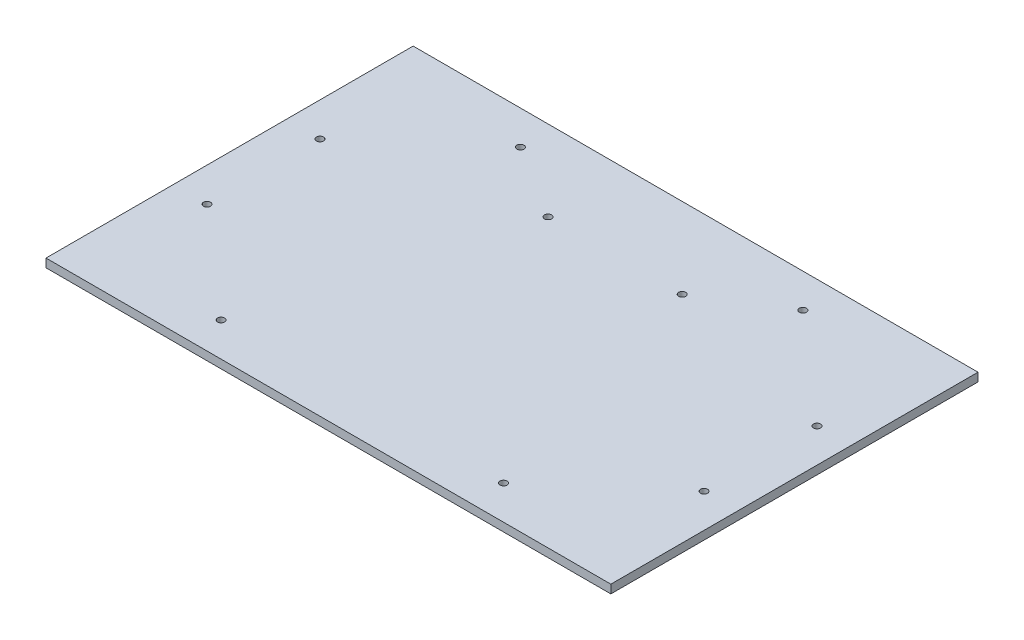
ISO-10303-21;
HEADER;
FILE_DESCRIPTION(('STEP AP214'),'2;1');
FILE_NAME('part.step','',(''),(''),'','','');
FILE_SCHEMA(('AUTOMOTIVE_DESIGN { 1 0 10303 214 1 1 1 1 }'));
ENDSEC;
DATA;
#1=APPLICATION_CONTEXT('core data for automotive mechanical design processes');
#2=APPLICATION_PROTOCOL_DEFINITION('international standard','automotive_design',2000,#1);
#3=PRODUCT_CONTEXT('',#1,'mechanical');
#4=PRODUCT('Part','Part','',(#3));
#5=PRODUCT_RELATED_PRODUCT_CATEGORY('part','',(#4));
#6=PRODUCT_DEFINITION_FORMATION('','',#4);
#7=PRODUCT_DEFINITION_CONTEXT('part definition',#1,'design');
#8=PRODUCT_DEFINITION('design','',#6,#7);
#9=PRODUCT_DEFINITION_SHAPE('','',#8);
#10=(LENGTH_UNIT() NAMED_UNIT(*) SI_UNIT(.MILLI.,.METRE.));
#11=(NAMED_UNIT(*) PLANE_ANGLE_UNIT() SI_UNIT($,.RADIAN.));
#12=(NAMED_UNIT(*) SI_UNIT($,.STERADIAN.) SOLID_ANGLE_UNIT());
#13=UNCERTAINTY_MEASURE_WITH_UNIT(LENGTH_MEASURE(1.E-05),#10,'distance_accuracy_value','');
#14=(GEOMETRIC_REPRESENTATION_CONTEXT(3) GLOBAL_UNCERTAINTY_ASSIGNED_CONTEXT((#13)) GLOBAL_UNIT_ASSIGNED_CONTEXT((#10,
#11,#12)) REPRESENTATION_CONTEXT('',''));
#15=CARTESIAN_POINT('',(0.,0.,0.));
#16=DIRECTION('',(0.,0.,1.));
#17=DIRECTION('',(1.,0.,0.));
#18=AXIS2_PLACEMENT_3D('',#15,#16,#17);
#19=CARTESIAN_POINT('',(200.,5.99999999999998,130.));
#20=DIRECTION('',(-1.,0.,0.));
#21=DIRECTION('',(0.,0.,1.));
#22=AXIS2_PLACEMENT_3D('',#19,#20,#21);
#23=PLANE('',#22);
#24=DIRECTION('',(0.,0.,-1.));
#25=VECTOR('',#24,1.);
#26=CARTESIAN_POINT('',(200.,0.,130.));
#27=LINE('',#26,#25);
#28=CARTESIAN_POINT('',(200.,0.,130.));
#29=VERTEX_POINT('',#28);
#30=CARTESIAN_POINT('',(200.,-1.2490009027033E-12,-130.));
#31=VERTEX_POINT('',#30);
#32=EDGE_CURVE('E123',#29,#31,#27,.T.);
#33=ORIENTED_EDGE('',*,*,#32,.T.);
#34=DIRECTION('',(0.,-1.,0.));
#35=VECTOR('',#34,1.);
#36=CARTESIAN_POINT('',(200.,5.99999999999876,-130.));
#37=LINE('',#36,#35);
#38=CARTESIAN_POINT('',(200.,5.99999999999876,-130.));
#39=VERTEX_POINT('',#38);
#40=EDGE_CURVE('E111',#39,#31,#37,.T.);
#41=ORIENTED_EDGE('',*,*,#40,.F.);
#42=DIRECTION('',(0.,0.,-1.));
#43=VECTOR('',#42,1.);
#44=CARTESIAN_POINT('',(200.,5.99999999999998,130.));
#45=LINE('',#44,#43);
#46=CARTESIAN_POINT('',(200.,5.99999999999998,130.));
#47=VERTEX_POINT('',#46);
#48=EDGE_CURVE('E103',#47,#39,#45,.T.);
#49=ORIENTED_EDGE('',*,*,#48,.F.);
#50=DIRECTION('',(0.,-1.,0.));
#51=VECTOR('',#50,1.);
#52=CARTESIAN_POINT('',(200.,5.99999999999998,130.));
#53=LINE('',#52,#51);
#54=EDGE_CURVE('E119',#47,#29,#53,.T.);
#55=ORIENTED_EDGE('',*,*,#54,.T.);
#56=EDGE_LOOP('',(#33,#41,#49,#55));
#57=FACE_BOUND('',#56,.T.);
#58=ADVANCED_FACE('F49',(#57),#23,.F.);
#59=CARTESIAN_POINT('',(-200.,5.99999999999876,-130.));
#60=DIRECTION('',(0.,0.,1.));
#61=DIRECTION('',(1.,0.,0.));
#62=AXIS2_PLACEMENT_3D('',#59,#60,#61);
#63=PLANE('',#62);
#64=DIRECTION('',(-1.,0.,0.));
#65=VECTOR('',#64,1.);
#66=CARTESIAN_POINT('',(-200.,-1.2490009027033E-12,-130.));
#67=LINE('',#66,#65);
#68=CARTESIAN_POINT('',(-200.,-1.2490009027033E-12,-130.));
#69=VERTEX_POINT('',#68);
#70=EDGE_CURVE('E109',#31,#69,#67,.T.);
#71=ORIENTED_EDGE('',*,*,#70,.T.);
#72=DIRECTION('',(0.,-1.,0.));
#73=VECTOR('',#72,1.);
#74=CARTESIAN_POINT('',(-200.,5.99999999999876,-130.));
#75=LINE('',#74,#73);
#76=CARTESIAN_POINT('',(-200.,5.99999999999876,-130.));
#77=VERTEX_POINT('',#76);
#78=EDGE_CURVE('E107',#77,#69,#75,.T.);
#79=ORIENTED_EDGE('',*,*,#78,.F.);
#80=DIRECTION('',(-1.,0.,0.));
#81=VECTOR('',#80,1.);
#82=CARTESIAN_POINT('',(-200.,5.99999999999876,-130.));
#83=LINE('',#82,#81);
#84=EDGE_CURVE('E98',#39,#77,#83,.T.);
#85=ORIENTED_EDGE('',*,*,#84,.F.);
#86=ORIENTED_EDGE('',*,*,#40,.T.);
#87=EDGE_LOOP('',(#71,#79,#85,#86));
#88=FACE_BOUND('',#87,.T.);
#89=ADVANCED_FACE('F108',(#88),#63,.F.);
#90=CARTESIAN_POINT('',(-200.,5.99999999999998,130.));
#91=DIRECTION('',(1.,0.,0.));
#92=DIRECTION('',(0.,0.,-1.));
#93=AXIS2_PLACEMENT_3D('',#90,#91,#92);
#94=PLANE('',#93);
#95=DIRECTION('',(0.,0.,1.));
#96=VECTOR('',#95,1.);
#97=CARTESIAN_POINT('',(-200.,0.,130.));
#98=LINE('',#97,#96);
#99=CARTESIAN_POINT('',(-200.,0.,130.));
#100=VERTEX_POINT('',#99);
#101=EDGE_CURVE('E84',#69,#100,#98,.T.);
#102=ORIENTED_EDGE('',*,*,#101,.T.);
#103=DIRECTION('',(0.,-1.,0.));
#104=VECTOR('',#103,1.);
#105=CARTESIAN_POINT('',(-200.,5.99999999999998,130.));
#106=LINE('',#105,#104);
#107=CARTESIAN_POINT('',(-200.,5.99999999999998,130.));
#108=VERTEX_POINT('',#107);
#109=EDGE_CURVE('E112',#108,#100,#106,.T.);
#110=ORIENTED_EDGE('',*,*,#109,.F.);
#111=DIRECTION('',(0.,0.,1.));
#112=VECTOR('',#111,1.);
#113=CARTESIAN_POINT('',(-200.,5.99999999999998,130.));
#114=LINE('',#113,#112);
#115=EDGE_CURVE('E101',#77,#108,#114,.T.);
#116=ORIENTED_EDGE('',*,*,#115,.F.);
#117=ORIENTED_EDGE('',*,*,#78,.T.);
#118=EDGE_LOOP('',(#102,#110,#116,#117));
#119=FACE_BOUND('',#118,.T.);
#120=ADVANCED_FACE('F114',(#119),#94,.F.);
#121=CARTESIAN_POINT('',(-200.,5.99999999999998,130.));
#122=DIRECTION('',(0.,0.,-1.));
#123=DIRECTION('',(-1.,0.,0.));
#124=AXIS2_PLACEMENT_3D('',#121,#122,#123);
#125=PLANE('',#124);
#126=DIRECTION('',(1.,0.,0.));
#127=VECTOR('',#126,1.);
#128=CARTESIAN_POINT('',(-200.,0.,130.));
#129=LINE('',#128,#127);
#130=EDGE_CURVE('E90',#100,#29,#129,.T.);
#131=ORIENTED_EDGE('',*,*,#130,.T.);
#132=ORIENTED_EDGE('',*,*,#54,.F.);
#133=DIRECTION('',(1.,0.,0.));
#134=VECTOR('',#133,1.);
#135=CARTESIAN_POINT('',(-200.,5.99999999999998,130.));
#136=LINE('',#135,#134);
#137=EDGE_CURVE('E67',#108,#47,#136,.T.);
#138=ORIENTED_EDGE('',*,*,#137,.F.);
#139=ORIENTED_EDGE('',*,*,#109,.T.);
#140=EDGE_LOOP('',(#131,#132,#138,#139));
#141=FACE_BOUND('',#140,.T.);
#142=ADVANCED_FACE('F265',(#141),#125,.F.);
#143=CARTESIAN_POINT('',(0.,6.00000000000001,0.));
#144=DIRECTION('',(0.,-1.,0.));
#145=DIRECTION('',(0.,0.,-1.));
#146=AXIS2_PLACEMENT_3D('',#143,#144,#145);
#147=PLANE('',#146);
#148=CARTESIAN_POINT('',(47.5,6.00000000000001,-73.));
#149=DIRECTION('',(0.,-1.,0.));
#150=DIRECTION('',(0.,0.,-1.));
#151=AXIS2_PLACEMENT_3D('',#148,#149,#150);
#152=CIRCLE('',#151,2.5);
#153=CARTESIAN_POINT('',(47.5,6.00000000000001,-75.5));
#154=VERTEX_POINT('',#153);
#155=EDGE_CURVE('E166',#154,#154,#152,.T.);
#156=ORIENTED_EDGE('',*,*,#155,.T.);
#157=EDGE_LOOP('',(#156));
#158=FACE_BOUND('',#157,.T.);
#159=CARTESIAN_POINT('',(-47.5,6.00000000000001,-73.));
#160=DIRECTION('',(0.,-1.,0.));
#161=DIRECTION('',(0.,0.,-1.));
#162=AXIS2_PLACEMENT_3D('',#159,#160,#161);
#163=CIRCLE('',#162,2.5);
#164=CARTESIAN_POINT('',(-47.5,6.00000000000001,-75.5));
#165=VERTEX_POINT('',#164);
#166=EDGE_CURVE('E164',#165,#165,#163,.T.);
#167=ORIENTED_EDGE('',*,*,#166,.T.);
#168=EDGE_LOOP('',(#167));
#169=FACE_BOUND('',#168,.T.);
#170=CARTESIAN_POINT('',(-176.,5.99999999999956,40.));
#171=DIRECTION('',(0.,-1.,0.));
#172=DIRECTION('',(0.,0.,-1.));
#173=AXIS2_PLACEMENT_3D('',#170,#171,#172);
#174=CIRCLE('',#173,2.5);
#175=CARTESIAN_POINT('',(-176.,5.99999999999956,37.5));
#176=VERTEX_POINT('',#175);
#177=EDGE_CURVE('E169',#176,#176,#174,.T.);
#178=ORIENTED_EDGE('',*,*,#177,.T.);
#179=EDGE_LOOP('',(#178));
#180=FACE_BOUND('',#179,.T.);
#181=CARTESIAN_POINT('',(-176.,6.00000000000001,-40.));
#182=DIRECTION('',(0.,-1.,0.));
#183=DIRECTION('',(0.,0.,-1.));
#184=AXIS2_PLACEMENT_3D('',#181,#182,#183);
#185=CIRCLE('',#184,2.5);
#186=CARTESIAN_POINT('',(-176.,6.00000000000001,-42.5));
#187=VERTEX_POINT('',#186);
#188=EDGE_CURVE('E217',#187,#187,#185,.T.);
#189=ORIENTED_EDGE('',*,*,#188,.T.);
#190=EDGE_LOOP('',(#189));
#191=FACE_BOUND('',#190,.T.);
#192=CARTESIAN_POINT('',(-100.,5.99999999999998,-106.));
#193=DIRECTION('',(0.,-1.,0.));
#194=DIRECTION('',(0.,0.,-1.));
#195=AXIS2_PLACEMENT_3D('',#192,#193,#194);
#196=CIRCLE('',#195,2.5);
#197=CARTESIAN_POINT('',(-100.,5.99999999999998,-108.5));
#198=VERTEX_POINT('',#197);
#199=EDGE_CURVE('E209',#198,#198,#196,.T.);
#200=ORIENTED_EDGE('',*,*,#199,.T.);
#201=EDGE_LOOP('',(#200));
#202=FACE_BOUND('',#201,.T.);
#203=CARTESIAN_POINT('',(100.,5.99999999999998,-106.));
#204=DIRECTION('',(0.,-1.,0.));
#205=DIRECTION('',(0.,0.,-1.));
#206=AXIS2_PLACEMENT_3D('',#203,#204,#205);
#207=CIRCLE('',#206,2.5);
#208=CARTESIAN_POINT('',(100.,5.99999999999998,-108.5));
#209=VERTEX_POINT('',#208);
#210=EDGE_CURVE('E201',#209,#209,#207,.T.);
#211=ORIENTED_EDGE('',*,*,#210,.T.);
#212=EDGE_LOOP('',(#211));
#213=FACE_BOUND('',#212,.T.);
#214=CARTESIAN_POINT('',(176.,6.00000000000001,-40.));
#215=DIRECTION('',(0.,-1.,0.));
#216=DIRECTION('',(0.,0.,-1.));
#217=AXIS2_PLACEMENT_3D('',#214,#215,#216);
#218=CIRCLE('',#217,2.5);
#219=CARTESIAN_POINT('',(176.,6.00000000000001,-42.5));
#220=VERTEX_POINT('',#219);
#221=EDGE_CURVE('E193',#220,#220,#218,.T.);
#222=ORIENTED_EDGE('',*,*,#221,.T.);
#223=EDGE_LOOP('',(#222));
#224=FACE_BOUND('',#223,.T.);
#225=CARTESIAN_POINT('',(176.,5.99999999999956,40.));
#226=DIRECTION('',(0.,-1.,0.));
#227=DIRECTION('',(0.,0.,-1.));
#228=AXIS2_PLACEMENT_3D('',#225,#226,#227);
#229=CIRCLE('',#228,2.5);
#230=CARTESIAN_POINT('',(176.,5.99999999999956,37.5));
#231=VERTEX_POINT('',#230);
#232=EDGE_CURVE('E185',#231,#231,#229,.T.);
#233=ORIENTED_EDGE('',*,*,#232,.T.);
#234=EDGE_LOOP('',(#233));
#235=FACE_BOUND('',#234,.T.);
#236=CARTESIAN_POINT('',(100.,5.99999999999876,106.));
#237=DIRECTION('',(0.,-1.,0.));
#238=DIRECTION('',(0.,0.,-1.));
#239=AXIS2_PLACEMENT_3D('',#236,#237,#238);
#240=CIRCLE('',#239,2.5);
#241=CARTESIAN_POINT('',(100.,5.99999999999876,103.5));
#242=VERTEX_POINT('',#241);
#243=EDGE_CURVE('E177',#242,#242,#240,.T.);
#244=ORIENTED_EDGE('',*,*,#243,.T.);
#245=EDGE_LOOP('',(#244));
#246=FACE_BOUND('',#245,.T.);
#247=CARTESIAN_POINT('',(-100.,5.99999999999876,106.));
#248=DIRECTION('',(0.,-1.,0.));
#249=DIRECTION('',(0.,0.,-1.));
#250=AXIS2_PLACEMENT_3D('',#247,#248,#249);
#251=CIRCLE('',#250,2.5);
#252=CARTESIAN_POINT('',(-100.,5.99999999999876,103.5));
#253=VERTEX_POINT('',#252);
#254=EDGE_CURVE('E127',#253,#253,#251,.T.);
#255=ORIENTED_EDGE('',*,*,#254,.T.);
#256=EDGE_LOOP('',(#255));
#257=FACE_BOUND('',#256,.T.);
#258=ORIENTED_EDGE('',*,*,#48,.T.);
#259=ORIENTED_EDGE('',*,*,#84,.T.);
#260=ORIENTED_EDGE('',*,*,#115,.T.);
#261=ORIENTED_EDGE('',*,*,#137,.T.);
#262=EDGE_LOOP('',(#258,#259,#260,#261));
#263=FACE_BOUND('',#262,.T.);
#264=ADVANCED_FACE('F99',(#158,#169,#180,#191,#202,#213,#224,#235,#246,#257,#263),#147,.F.);
#265=CARTESIAN_POINT('',(0.,0.,0.));
#266=DIRECTION('',(0.,-1.,0.));
#267=DIRECTION('',(0.,0.,-1.));
#268=AXIS2_PLACEMENT_3D('',#265,#266,#267);
#269=PLANE('',#268);
#270=CARTESIAN_POINT('',(-47.5,0.,-73.));
#271=DIRECTION('',(0.,-1.,0.));
#272=DIRECTION('',(0.,0.,-1.));
#273=AXIS2_PLACEMENT_3D('',#270,#271,#272);
#274=CIRCLE('',#273,4.50000000000006);
#275=CARTESIAN_POINT('',(-47.5,0.,-77.5000000000001));
#276=VERTEX_POINT('',#275);
#277=EDGE_CURVE('E59',#276,#276,#274,.F.);
#278=ORIENTED_EDGE('',*,*,#277,.T.);
#279=EDGE_LOOP('',(#278));
#280=FACE_BOUND('',#279,.T.);
#281=CARTESIAN_POINT('',(47.5,0.,-73.));
#282=DIRECTION('',(0.,-1.,0.));
#283=DIRECTION('',(0.,0.,-1.));
#284=AXIS2_PLACEMENT_3D('',#281,#282,#283);
#285=CIRCLE('',#284,4.50000000000006);
#286=CARTESIAN_POINT('',(47.5,0.,-77.5000000000001));
#287=VERTEX_POINT('',#286);
#288=EDGE_CURVE('E143',#287,#287,#285,.F.);
#289=ORIENTED_EDGE('',*,*,#288,.T.);
#290=EDGE_LOOP('',(#289));
#291=FACE_BOUND('',#290,.T.);
#292=CARTESIAN_POINT('',(-176.,-4.44089209850063E-13,40.));
#293=DIRECTION('',(0.,-1.,0.));
#294=DIRECTION('',(0.,0.,-1.));
#295=AXIS2_PLACEMENT_3D('',#292,#293,#294);
#296=CIRCLE('',#295,2.5);
#297=CARTESIAN_POINT('',(-176.,-4.44089209850063E-13,37.5));
#298=VERTEX_POINT('',#297);
#299=EDGE_CURVE('E221',#298,#298,#296,.T.);
#300=ORIENTED_EDGE('',*,*,#299,.F.);
#301=EDGE_LOOP('',(#300));
#302=FACE_BOUND('',#301,.T.);
#303=CARTESIAN_POINT('',(-176.,0.,-40.));
#304=DIRECTION('',(0.,-1.,0.));
#305=DIRECTION('',(0.,0.,-1.));
#306=AXIS2_PLACEMENT_3D('',#303,#304,#305);
#307=CIRCLE('',#306,2.5);
#308=CARTESIAN_POINT('',(-176.,0.,-42.5));
#309=VERTEX_POINT('',#308);
#310=EDGE_CURVE('E213',#309,#309,#307,.T.);
#311=ORIENTED_EDGE('',*,*,#310,.F.);
#312=EDGE_LOOP('',(#311));
#313=FACE_BOUND('',#312,.T.);
#314=CARTESIAN_POINT('',(-100.,0.,-106.));
#315=DIRECTION('',(0.,-1.,0.));
#316=DIRECTION('',(0.,0.,-1.));
#317=AXIS2_PLACEMENT_3D('',#314,#315,#316);
#318=CIRCLE('',#317,2.5);
#319=CARTESIAN_POINT('',(-100.,0.,-108.5));
#320=VERTEX_POINT('',#319);
#321=EDGE_CURVE('E205',#320,#320,#318,.T.);
#322=ORIENTED_EDGE('',*,*,#321,.F.);
#323=EDGE_LOOP('',(#322));
#324=FACE_BOUND('',#323,.T.);
#325=CARTESIAN_POINT('',(100.,0.,-106.));
#326=DIRECTION('',(0.,-1.,0.));
#327=DIRECTION('',(0.,0.,-1.));
#328=AXIS2_PLACEMENT_3D('',#325,#326,#327);
#329=CIRCLE('',#328,2.5);
#330=CARTESIAN_POINT('',(100.,0.,-108.5));
#331=VERTEX_POINT('',#330);
#332=EDGE_CURVE('E197',#331,#331,#329,.T.);
#333=ORIENTED_EDGE('',*,*,#332,.F.);
#334=EDGE_LOOP('',(#333));
#335=FACE_BOUND('',#334,.T.);
#336=CARTESIAN_POINT('',(176.,0.,-40.));
#337=DIRECTION('',(0.,-1.,0.));
#338=DIRECTION('',(0.,0.,-1.));
#339=AXIS2_PLACEMENT_3D('',#336,#337,#338);
#340=CIRCLE('',#339,2.5);
#341=CARTESIAN_POINT('',(176.,0.,-42.5));
#342=VERTEX_POINT('',#341);
#343=EDGE_CURVE('E189',#342,#342,#340,.T.);
#344=ORIENTED_EDGE('',*,*,#343,.F.);
#345=EDGE_LOOP('',(#344));
#346=FACE_BOUND('',#345,.T.);
#347=CARTESIAN_POINT('',(176.,-4.44089209850063E-13,40.));
#348=DIRECTION('',(0.,-1.,0.));
#349=DIRECTION('',(0.,0.,-1.));
#350=AXIS2_PLACEMENT_3D('',#347,#348,#349);
#351=CIRCLE('',#350,2.5);
#352=CARTESIAN_POINT('',(176.,-4.44089209850063E-13,37.5));
#353=VERTEX_POINT('',#352);
#354=EDGE_CURVE('E181',#353,#353,#351,.T.);
#355=ORIENTED_EDGE('',*,*,#354,.F.);
#356=EDGE_LOOP('',(#355));
#357=FACE_BOUND('',#356,.T.);
#358=CARTESIAN_POINT('',(100.,-1.2490009027033E-12,106.));
#359=DIRECTION('',(0.,-1.,0.));
#360=DIRECTION('',(0.,0.,-1.));
#361=AXIS2_PLACEMENT_3D('',#358,#359,#360);
#362=CIRCLE('',#361,2.5);
#363=CARTESIAN_POINT('',(100.,-1.2490009027033E-12,103.5));
#364=VERTEX_POINT('',#363);
#365=EDGE_CURVE('E172',#364,#364,#362,.T.);
#366=ORIENTED_EDGE('',*,*,#365,.F.);
#367=EDGE_LOOP('',(#366));
#368=FACE_BOUND('',#367,.T.);
#369=CARTESIAN_POINT('',(-100.,-1.2490009027033E-12,106.));
#370=DIRECTION('',(0.,-1.,0.));
#371=DIRECTION('',(0.,0.,-1.));
#372=AXIS2_PLACEMENT_3D('',#369,#370,#371);
#373=CIRCLE('',#372,2.5);
#374=CARTESIAN_POINT('',(-100.,-1.2490009027033E-12,103.5));
#375=VERTEX_POINT('',#374);
#376=EDGE_CURVE('E176',#375,#375,#373,.T.);
#377=ORIENTED_EDGE('',*,*,#376,.F.);
#378=EDGE_LOOP('',(#377));
#379=FACE_BOUND('',#378,.T.);
#380=ORIENTED_EDGE('',*,*,#32,.F.);
#381=ORIENTED_EDGE('',*,*,#130,.F.);
#382=ORIENTED_EDGE('',*,*,#101,.F.);
#383=ORIENTED_EDGE('',*,*,#70,.F.);
#384=EDGE_LOOP('',(#380,#381,#382,#383));
#385=FACE_BOUND('',#384,.T.);
#386=ADVANCED_FACE('F148',(#280,#291,#302,#313,#324,#335,#346,#357,#368,#379,#385),#269,.T.);
#387=CARTESIAN_POINT('',(-100.,5.99999999999876,106.));
#388=DIRECTION('',(0.,-1.,0.));
#389=DIRECTION('',(0.,0.,-1.));
#390=AXIS2_PLACEMENT_3D('',#387,#388,#389);
#391=CYLINDRICAL_SURFACE('',#390,2.5);
#392=ORIENTED_EDGE('',*,*,#254,.F.);
#393=EDGE_LOOP('',(#392));
#394=FACE_BOUND('',#393,.T.);
#395=ORIENTED_EDGE('',*,*,#376,.T.);
#396=EDGE_LOOP('',(#395));
#397=FACE_BOUND('',#396,.T.);
#398=ADVANCED_FACE('F258',(#394,#397),#391,.F.);
#399=CARTESIAN_POINT('',(100.,5.99999999999876,106.));
#400=DIRECTION('',(0.,-1.,0.));
#401=DIRECTION('',(0.,0.,-1.));
#402=AXIS2_PLACEMENT_3D('',#399,#400,#401);
#403=CYLINDRICAL_SURFACE('',#402,2.5);
#404=ORIENTED_EDGE('',*,*,#243,.F.);
#405=EDGE_LOOP('',(#404));
#406=FACE_BOUND('',#405,.T.);
#407=ORIENTED_EDGE('',*,*,#365,.T.);
#408=EDGE_LOOP('',(#407));
#409=FACE_BOUND('',#408,.T.);
#410=ADVANCED_FACE('F321',(#406,#409),#403,.F.);
#411=CARTESIAN_POINT('',(176.,5.99999999999956,40.));
#412=DIRECTION('',(0.,-1.,0.));
#413=DIRECTION('',(0.,0.,-1.));
#414=AXIS2_PLACEMENT_3D('',#411,#412,#413);
#415=CYLINDRICAL_SURFACE('',#414,2.5);
#416=ORIENTED_EDGE('',*,*,#232,.F.);
#417=EDGE_LOOP('',(#416));
#418=FACE_BOUND('',#417,.T.);
#419=ORIENTED_EDGE('',*,*,#354,.T.);
#420=EDGE_LOOP('',(#419));
#421=FACE_BOUND('',#420,.T.);
#422=ADVANCED_FACE('F331',(#418,#421),#415,.F.);
#423=CARTESIAN_POINT('',(176.,6.00000000000001,-40.));
#424=DIRECTION('',(0.,-1.,0.));
#425=DIRECTION('',(0.,0.,-1.));
#426=AXIS2_PLACEMENT_3D('',#423,#424,#425);
#427=CYLINDRICAL_SURFACE('',#426,2.5);
#428=ORIENTED_EDGE('',*,*,#221,.F.);
#429=EDGE_LOOP('',(#428));
#430=FACE_BOUND('',#429,.T.);
#431=ORIENTED_EDGE('',*,*,#343,.T.);
#432=EDGE_LOOP('',(#431));
#433=FACE_BOUND('',#432,.T.);
#434=ADVANCED_FACE('F341',(#430,#433),#427,.F.);
#435=CARTESIAN_POINT('',(100.,5.99999999999998,-106.));
#436=DIRECTION('',(0.,-1.,0.));
#437=DIRECTION('',(0.,0.,-1.));
#438=AXIS2_PLACEMENT_3D('',#435,#436,#437);
#439=CYLINDRICAL_SURFACE('',#438,2.5);
#440=ORIENTED_EDGE('',*,*,#210,.F.);
#441=EDGE_LOOP('',(#440));
#442=FACE_BOUND('',#441,.T.);
#443=ORIENTED_EDGE('',*,*,#332,.T.);
#444=EDGE_LOOP('',(#443));
#445=FACE_BOUND('',#444,.T.);
#446=ADVANCED_FACE('F351',(#442,#445),#439,.F.);
#447=CARTESIAN_POINT('',(-100.,5.99999999999998,-106.));
#448=DIRECTION('',(0.,-1.,0.));
#449=DIRECTION('',(0.,0.,-1.));
#450=AXIS2_PLACEMENT_3D('',#447,#448,#449);
#451=CYLINDRICAL_SURFACE('',#450,2.5);
#452=ORIENTED_EDGE('',*,*,#199,.F.);
#453=EDGE_LOOP('',(#452));
#454=FACE_BOUND('',#453,.T.);
#455=ORIENTED_EDGE('',*,*,#321,.T.);
#456=EDGE_LOOP('',(#455));
#457=FACE_BOUND('',#456,.T.);
#458=ADVANCED_FACE('F361',(#454,#457),#451,.F.);
#459=CARTESIAN_POINT('',(-176.,6.00000000000001,-40.));
#460=DIRECTION('',(0.,-1.,0.));
#461=DIRECTION('',(0.,0.,-1.));
#462=AXIS2_PLACEMENT_3D('',#459,#460,#461);
#463=CYLINDRICAL_SURFACE('',#462,2.5);
#464=ORIENTED_EDGE('',*,*,#188,.F.);
#465=EDGE_LOOP('',(#464));
#466=FACE_BOUND('',#465,.T.);
#467=ORIENTED_EDGE('',*,*,#310,.T.);
#468=EDGE_LOOP('',(#467));
#469=FACE_BOUND('',#468,.T.);
#470=ADVANCED_FACE('F371',(#466,#469),#463,.F.);
#471=CARTESIAN_POINT('',(-176.,5.99999999999956,40.));
#472=DIRECTION('',(0.,-1.,0.));
#473=DIRECTION('',(0.,0.,-1.));
#474=AXIS2_PLACEMENT_3D('',#471,#472,#473);
#475=CYLINDRICAL_SURFACE('',#474,2.5);
#476=ORIENTED_EDGE('',*,*,#177,.F.);
#477=EDGE_LOOP('',(#476));
#478=FACE_BOUND('',#477,.T.);
#479=ORIENTED_EDGE('',*,*,#299,.T.);
#480=EDGE_LOOP('',(#479));
#481=FACE_BOUND('',#480,.T.);
#482=ADVANCED_FACE('F160',(#478,#481),#475,.F.);
#483=CARTESIAN_POINT('',(-47.5,6.00000000000001,-73.));
#484=DIRECTION('',(0.,-1.,0.));
#485=DIRECTION('',(0.,0.,-1.));
#486=AXIS2_PLACEMENT_3D('',#483,#484,#485);
#487=CYLINDRICAL_SURFACE('',#486,2.5);
#488=CARTESIAN_POINT('',(-47.5,2.00000000000007,-73.));
#489=DIRECTION('',(0.,-1.,0.));
#490=DIRECTION('',(0.,0.,-1.));
#491=AXIS2_PLACEMENT_3D('',#488,#489,#490);
#492=CIRCLE('',#491,2.5);
#493=CARTESIAN_POINT('',(-47.5,2.00000000000007,-75.5));
#494=VERTEX_POINT('',#493);
#495=EDGE_CURVE('E140',#494,#494,#492,.T.);
#496=ORIENTED_EDGE('',*,*,#495,.T.);
#497=EDGE_LOOP('',(#496));
#498=FACE_BOUND('',#497,.T.);
#499=ORIENTED_EDGE('',*,*,#166,.F.);
#500=EDGE_LOOP('',(#499));
#501=FACE_BOUND('',#500,.T.);
#502=ADVANCED_FACE('F157',(#498,#501),#487,.F.);
#503=CARTESIAN_POINT('',(47.5,6.00000000000001,-73.));
#504=DIRECTION('',(0.,-1.,0.));
#505=DIRECTION('',(0.,0.,-1.));
#506=AXIS2_PLACEMENT_3D('',#503,#504,#505);
#507=CYLINDRICAL_SURFACE('',#506,2.5);
#508=CARTESIAN_POINT('',(47.5,2.00000000000007,-73.));
#509=DIRECTION('',(0.,-1.,0.));
#510=DIRECTION('',(0.,0.,-1.));
#511=AXIS2_PLACEMENT_3D('',#508,#509,#510);
#512=CIRCLE('',#511,2.5);
#513=CARTESIAN_POINT('',(47.5,2.00000000000007,-75.5));
#514=VERTEX_POINT('',#513);
#515=EDGE_CURVE('E11',#514,#514,#512,.T.);
#516=ORIENTED_EDGE('',*,*,#515,.T.);
#517=EDGE_LOOP('',(#516));
#518=FACE_BOUND('',#517,.T.);
#519=ORIENTED_EDGE('',*,*,#155,.F.);
#520=EDGE_LOOP('',(#519));
#521=FACE_BOUND('',#520,.T.);
#522=ADVANCED_FACE('F154',(#518,#521),#507,.F.);
#523=CARTESIAN_POINT('',(-47.5,2.00000000000007,-73.));
#524=DIRECTION('',(0.,-1.,0.));
#525=DIRECTION('',(0.,0.,-1.));
#526=AXIS2_PLACEMENT_3D('',#523,#524,#525);
#527=CONICAL_SURFACE('',#526,2.5,0.785398163397446);
#528=ORIENTED_EDGE('',*,*,#277,.F.);
#529=EDGE_LOOP('',(#528));
#530=FACE_BOUND('',#529,.T.);
#531=ORIENTED_EDGE('',*,*,#495,.F.);
#532=EDGE_LOOP('',(#531));
#533=FACE_BOUND('',#532,.T.);
#534=ADVANCED_FACE('F151',(#530,#533),#527,.F.);
#535=CARTESIAN_POINT('',(47.5,2.00000000000007,-73.));
#536=DIRECTION('',(0.,-1.,0.));
#537=DIRECTION('',(0.,0.,-1.));
#538=AXIS2_PLACEMENT_3D('',#535,#536,#537);
#539=CONICAL_SURFACE('',#538,2.5,0.785398163397446);
#540=ORIENTED_EDGE('',*,*,#288,.F.);
#541=EDGE_LOOP('',(#540));
#542=FACE_BOUND('',#541,.T.);
#543=ORIENTED_EDGE('',*,*,#515,.F.);
#544=EDGE_LOOP('',(#543));
#545=FACE_BOUND('',#544,.T.);
#546=ADVANCED_FACE('F52',(#542,#545),#539,.F.);
#547=CLOSED_SHELL('',(#58,#89,#120,#142,#264,#386,#398,#410,#422,#434,#446,#458,#470,#482,#502,
#522,#534,#546));
#548=MANIFOLD_SOLID_BREP('B2',#547);
#549=ADVANCED_BREP_SHAPE_REPRESENTATION('',(#18,#548),#14);
#550=SHAPE_DEFINITION_REPRESENTATION(#9,#549);
ENDSEC;
END-ISO-10303-21;
